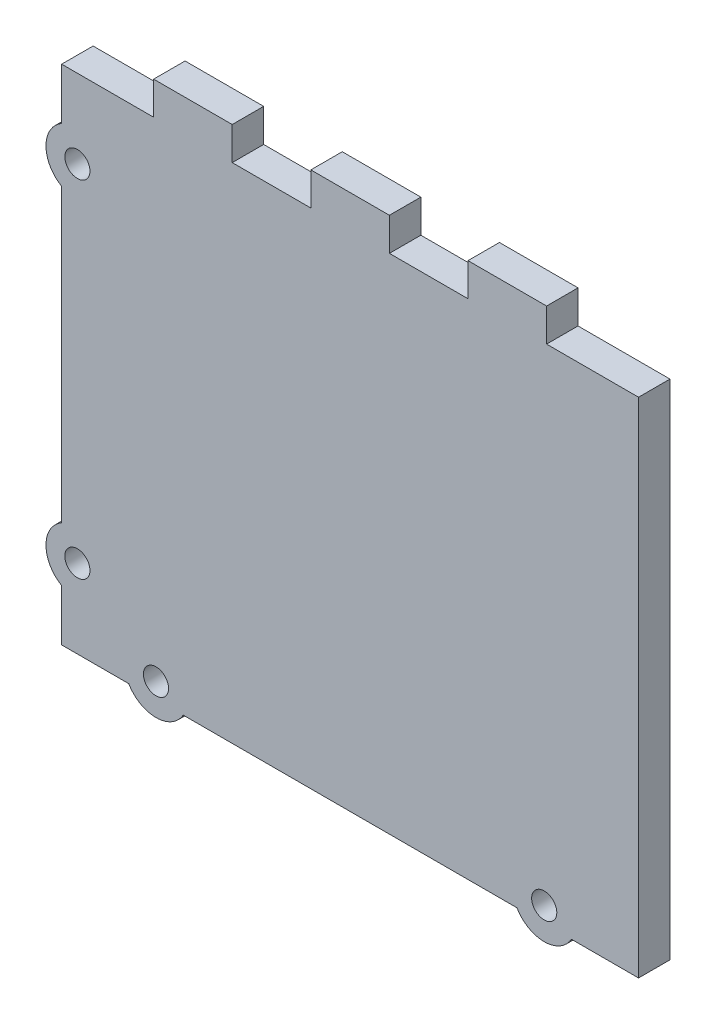
ISO-10303-21;
HEADER;
FILE_DESCRIPTION(('STEP AP214'),'2;1');
FILE_NAME('part.step','',(''),(''),'','','');
FILE_SCHEMA(('AUTOMOTIVE_DESIGN { 1 0 10303 214 1 1 1 1 }'));
ENDSEC;
DATA;
#1=APPLICATION_CONTEXT('core data for automotive mechanical design processes');
#2=APPLICATION_PROTOCOL_DEFINITION('international standard','automotive_design',2000,#1);
#3=PRODUCT_CONTEXT('',#1,'mechanical');
#4=PRODUCT('Part','Part','',(#3));
#5=PRODUCT_RELATED_PRODUCT_CATEGORY('part','',(#4));
#6=PRODUCT_DEFINITION_FORMATION('','',#4);
#7=PRODUCT_DEFINITION_CONTEXT('part definition',#1,'design');
#8=PRODUCT_DEFINITION('design','',#6,#7);
#9=PRODUCT_DEFINITION_SHAPE('','',#8);
#10=(LENGTH_UNIT() NAMED_UNIT(*) SI_UNIT(.MILLI.,.METRE.));
#11=(NAMED_UNIT(*) PLANE_ANGLE_UNIT() SI_UNIT($,.RADIAN.));
#12=(NAMED_UNIT(*) SI_UNIT($,.STERADIAN.) SOLID_ANGLE_UNIT());
#13=UNCERTAINTY_MEASURE_WITH_UNIT(LENGTH_MEASURE(1.E-05),#10,'distance_accuracy_value','');
#14=(GEOMETRIC_REPRESENTATION_CONTEXT(3) GLOBAL_UNCERTAINTY_ASSIGNED_CONTEXT((#13)) GLOBAL_UNIT_ASSIGNED_CONTEXT((#10,
#11,#12)) REPRESENTATION_CONTEXT('',''));
#15=CARTESIAN_POINT('',(0.,0.,0.));
#16=DIRECTION('',(0.,0.,1.));
#17=DIRECTION('',(1.,0.,0.));
#18=AXIS2_PLACEMENT_3D('',#15,#16,#17);
#19=CARTESIAN_POINT('',(25.2000000041631,29.5000000000222,4.));
#20=DIRECTION('',(1.,0.,0.));
#21=DIRECTION('',(0.,0.,-1.));
#22=AXIS2_PLACEMENT_3D('',#19,#20,#21);
#23=PLANE('',#22);
#24=DIRECTION('',(0.,-1.,0.));
#25=VECTOR('',#24,1.);
#26=CARTESIAN_POINT('',(25.2000000041631,29.5000000000222,4.));
#27=LINE('',#26,#25);
#28=CARTESIAN_POINT('',(25.2000000041631,34.0000000000222,4.));
#29=VERTEX_POINT('',#28);
#30=CARTESIAN_POINT('',(25.2000000041631,29.8000000000222,4.));
#31=VERTEX_POINT('',#30);
#32=EDGE_CURVE('E392',#29,#31,#27,.T.);
#33=ORIENTED_EDGE('',*,*,#32,.T.);
#34=DIRECTION('',(0.,0.,-1.));
#35=VECTOR('',#34,1.);
#36=CARTESIAN_POINT('',(25.2000000041631,29.8000000000222,4.));
#37=LINE('',#36,#35);
#38=CARTESIAN_POINT('',(25.2000000041631,29.8000000000222,0.));
#39=VERTEX_POINT('',#38);
#40=EDGE_CURVE('E388',#31,#39,#37,.T.);
#41=ORIENTED_EDGE('',*,*,#40,.T.);
#42=DIRECTION('',(0.,-1.,0.));
#43=VECTOR('',#42,1.);
#44=CARTESIAN_POINT('',(25.2000000041631,29.5000000000222,0.));
#45=LINE('',#44,#43);
#46=CARTESIAN_POINT('',(25.2000000041631,34.0000000000222,0.));
#47=VERTEX_POINT('',#46);
#48=EDGE_CURVE('E391',#47,#39,#45,.T.);
#49=ORIENTED_EDGE('',*,*,#48,.F.);
#50=DIRECTION('',(0.,0.,-1.));
#51=VECTOR('',#50,1.);
#52=CARTESIAN_POINT('',(25.2000000041631,34.0000000000222,4.));
#53=LINE('',#52,#51);
#54=EDGE_CURVE('E51',#29,#47,#53,.T.);
#55=ORIENTED_EDGE('',*,*,#54,.F.);
#56=EDGE_LOOP('',(#33,#41,#49,#55));
#57=FACE_BOUND('',#56,.T.);
#58=ADVANCED_FACE('F43',(#57),#23,.T.);
#59=CARTESIAN_POINT('',(15.2000000041631,29.5000000000222,4.));
#60=DIRECTION('',(-1.,0.,0.));
#61=DIRECTION('',(0.,0.,1.));
#62=AXIS2_PLACEMENT_3D('',#59,#60,#61);
#63=PLANE('',#62);
#64=DIRECTION('',(0.,1.,0.));
#65=VECTOR('',#64,1.);
#66=CARTESIAN_POINT('',(15.2000000041631,29.5000000000222,0.));
#67=LINE('',#66,#65);
#68=CARTESIAN_POINT('',(15.2000000041631,29.8000000000222,0.));
#69=VERTEX_POINT('',#68);
#70=CARTESIAN_POINT('',(15.2000000041631,34.0000000000222,0.));
#71=VERTEX_POINT('',#70);
#72=EDGE_CURVE('E70',#69,#71,#67,.T.);
#73=ORIENTED_EDGE('',*,*,#72,.F.);
#74=DIRECTION('',(0.,0.,1.));
#75=VECTOR('',#74,1.);
#76=CARTESIAN_POINT('',(15.2000000041631,29.8000000000222,4.));
#77=LINE('',#76,#75);
#78=CARTESIAN_POINT('',(15.2000000041631,29.8000000000222,4.));
#79=VERTEX_POINT('',#78);
#80=EDGE_CURVE('E11',#69,#79,#77,.T.);
#81=ORIENTED_EDGE('',*,*,#80,.T.);
#82=DIRECTION('',(0.,1.,0.));
#83=VECTOR('',#82,1.);
#84=CARTESIAN_POINT('',(15.2000000041631,29.5000000000222,4.));
#85=LINE('',#84,#83);
#86=CARTESIAN_POINT('',(15.2000000041631,34.0000000000222,4.));
#87=VERTEX_POINT('',#86);
#88=EDGE_CURVE('E394',#79,#87,#85,.T.);
#89=ORIENTED_EDGE('',*,*,#88,.T.);
#90=DIRECTION('',(0.,0.,-1.));
#91=VECTOR('',#90,1.);
#92=CARTESIAN_POINT('',(15.2000000041631,34.0000000000222,4.));
#93=LINE('',#92,#91);
#94=EDGE_CURVE('E400',#87,#71,#93,.T.);
#95=ORIENTED_EDGE('',*,*,#94,.T.);
#96=EDGE_LOOP('',(#73,#81,#89,#95));
#97=FACE_BOUND('',#96,.T.);
#98=ADVANCED_FACE('F408',(#97),#63,.T.);
#99=CARTESIAN_POINT('',(25.2000000041631,34.0000000000222,4.));
#100=DIRECTION('',(0.,1.,0.));
#101=DIRECTION('',(0.,0.,1.));
#102=AXIS2_PLACEMENT_3D('',#99,#100,#101);
#103=PLANE('',#102);
#104=DIRECTION('',(1.,0.,0.));
#105=VECTOR('',#104,1.);
#106=CARTESIAN_POINT('',(25.2000000041631,34.0000000000222,0.));
#107=LINE('',#106,#105);
#108=EDGE_CURVE('E395',#71,#47,#107,.T.);
#109=ORIENTED_EDGE('',*,*,#108,.F.);
#110=ORIENTED_EDGE('',*,*,#94,.F.);
#111=DIRECTION('',(1.,0.,0.));
#112=VECTOR('',#111,1.);
#113=CARTESIAN_POINT('',(25.2000000041631,34.0000000000222,4.));
#114=LINE('',#113,#112);
#115=EDGE_CURVE('E397',#87,#29,#114,.T.);
#116=ORIENTED_EDGE('',*,*,#115,.T.);
#117=ORIENTED_EDGE('',*,*,#54,.T.);
#118=EDGE_LOOP('',(#109,#110,#116,#117));
#119=FACE_BOUND('',#118,.T.);
#120=ADVANCED_FACE('F411',(#119),#103,.T.);
#121=CARTESIAN_POINT('',(0.,0.,4.));
#122=DIRECTION('',(0.,0.,1.));
#123=DIRECTION('',(1.,0.,0.));
#124=AXIS2_PLACEMENT_3D('',#121,#122,#123);
#125=PLANE('',#124);
#126=ORIENTED_EDGE('',*,*,#88,.F.);
#127=DIRECTION('',(-1.,0.,0.));
#128=VECTOR('',#127,1.);
#129=CARTESIAN_POINT('',(-36.4999999999631,29.8000000000222,4.));
#130=LINE('',#129,#128);
#131=CARTESIAN_POINT('',(5.20000000416307,29.8000000000222,4.));
#132=VERTEX_POINT('',#131);
#133=EDGE_CURVE('E78',#79,#132,#130,.T.);
#134=ORIENTED_EDGE('',*,*,#133,.T.);
#135=DIRECTION('',(0.,-1.,0.));
#136=VECTOR('',#135,1.);
#137=CARTESIAN_POINT('',(5.20000000416307,29.5000000000222,4.));
#138=LINE('',#137,#136);
#139=CARTESIAN_POINT('',(5.20000000416307,34.0000000000222,4.));
#140=VERTEX_POINT('',#139);
#141=EDGE_CURVE('E254',#140,#132,#138,.T.);
#142=ORIENTED_EDGE('',*,*,#141,.F.);
#143=DIRECTION('',(1.,0.,0.));
#144=VECTOR('',#143,1.);
#145=CARTESIAN_POINT('',(5.20000000416307,34.0000000000222,4.));
#146=LINE('',#145,#144);
#147=CARTESIAN_POINT('',(-4.79999999583693,34.0000000000222,4.));
#148=VERTEX_POINT('',#147);
#149=EDGE_CURVE('E250',#148,#140,#146,.T.);
#150=ORIENTED_EDGE('',*,*,#149,.F.);
#151=DIRECTION('',(0.,1.,0.));
#152=VECTOR('',#151,1.);
#153=CARTESIAN_POINT('',(-4.79999999583693,29.5000000000222,4.));
#154=LINE('',#153,#152);
#155=CARTESIAN_POINT('',(-4.79999999583693,29.8000000000222,4.));
#156=VERTEX_POINT('',#155);
#157=EDGE_CURVE('E248',#156,#148,#154,.T.);
#158=ORIENTED_EDGE('',*,*,#157,.F.);
#159=CARTESIAN_POINT('',(-14.7999999958369,29.8000000000222,4.));
#160=VERTEX_POINT('',#159);
#161=EDGE_CURVE('E347',#156,#160,#130,.T.);
#162=ORIENTED_EDGE('',*,*,#161,.T.);
#163=DIRECTION('',(0.,-1.,0.));
#164=VECTOR('',#163,1.);
#165=CARTESIAN_POINT('',(-14.7999999958369,29.5000000000222,4.));
#166=LINE('',#165,#164);
#167=CARTESIAN_POINT('',(-14.7999999958369,34.0000000000222,4.));
#168=VERTEX_POINT('',#167);
#169=EDGE_CURVE('E228',#168,#160,#166,.T.);
#170=ORIENTED_EDGE('',*,*,#169,.F.);
#171=DIRECTION('',(1.,0.,0.));
#172=VECTOR('',#171,1.);
#173=CARTESIAN_POINT('',(-14.7999999958369,34.0000000000222,4.));
#174=LINE('',#173,#172);
#175=CARTESIAN_POINT('',(-24.7999999958369,34.0000000000222,4.));
#176=VERTEX_POINT('',#175);
#177=EDGE_CURVE('E218',#176,#168,#174,.T.);
#178=ORIENTED_EDGE('',*,*,#177,.F.);
#179=DIRECTION('',(0.,1.,0.));
#180=VECTOR('',#179,1.);
#181=CARTESIAN_POINT('',(-24.7999999958369,29.5000000000222,4.));
#182=LINE('',#181,#180);
#183=CARTESIAN_POINT('',(-24.7999999958369,29.8000000000222,4.));
#184=VERTEX_POINT('',#183);
#185=EDGE_CURVE('E208',#184,#176,#182,.T.);
#186=ORIENTED_EDGE('',*,*,#185,.F.);
#187=CARTESIAN_POINT('',(-36.4999999999631,29.8000000000222,4.));
#188=VERTEX_POINT('',#187);
#189=EDGE_CURVE('E341',#184,#188,#130,.T.);
#190=ORIENTED_EDGE('',*,*,#189,.T.);
#191=DIRECTION('',(0.,-1.,0.));
#192=VECTOR('',#191,1.);
#193=CARTESIAN_POINT('',(-36.4999999999631,29.8000000000222,4.));
#194=LINE('',#193,#192);
#195=CARTESIAN_POINT('',(-36.4999999999631,23.2641016151781,4.));
#196=VERTEX_POINT('',#195);
#197=EDGE_CURVE('E348',#188,#196,#194,.T.);
#198=ORIENTED_EDGE('',*,*,#197,.T.);
#199=CARTESIAN_POINT('',(-34.4999999999631,19.8000000000403,4.));
#200=DIRECTION('',(0.,0.,1.));
#201=DIRECTION('',(1.,0.,0.));
#202=AXIS2_PLACEMENT_3D('',#199,#200,#201);
#203=CIRCLE('',#202,4.);
#204=CARTESIAN_POINT('',(-36.4999999999631,16.3358983849026,4.));
#205=VERTEX_POINT('',#204);
#206=EDGE_CURVE('E289',#205,#196,#203,.F.);
#207=ORIENTED_EDGE('',*,*,#206,.F.);
#208=CARTESIAN_POINT('',(-36.4999999999631,-20.7358983848461,4.));
#209=VERTEX_POINT('',#208);
#210=EDGE_CURVE('E352',#205,#209,#194,.T.);
#211=ORIENTED_EDGE('',*,*,#210,.T.);
#212=CARTESIAN_POINT('',(-34.4999999999631,-24.1999999999839,4.));
#213=DIRECTION('',(0.,0.,-1.));
#214=DIRECTION('',(1.,0.,0.));
#215=AXIS2_PLACEMENT_3D('',#212,#213,#214);
#216=CIRCLE('',#215,4.);
#217=CARTESIAN_POINT('',(-36.4999999999631,-27.6641016151217,4.));
#218=VERTEX_POINT('',#217);
#219=EDGE_CURVE('E272',#209,#218,#216,.F.);
#220=ORIENTED_EDGE('',*,*,#219,.T.);
#221=CARTESIAN_POINT('',(-36.4999999999631,-34.1999999999658,4.));
#222=VERTEX_POINT('',#221);
#223=EDGE_CURVE('E346',#218,#222,#194,.T.);
#224=ORIENTED_EDGE('',*,*,#223,.T.);
#225=DIRECTION('',(1.,0.,0.));
#226=VECTOR('',#225,1.);
#227=CARTESIAN_POINT('',(-36.4999999999631,-34.1999999999658,4.));
#228=LINE('',#227,#226);
#229=CARTESIAN_POINT('',(-27.9665338925389,-34.1999999999658,4.));
#230=VERTEX_POINT('',#229);
#231=EDGE_CURVE('E353',#222,#230,#228,.T.);
#232=ORIENTED_EDGE('',*,*,#231,.T.);
#233=CARTESIAN_POINT('',(-24.4999999958439,-32.2042187636916,4.));
#234=DIRECTION('',(0.,0.,-1.));
#235=DIRECTION('',(-1.,0.,0.));
#236=AXIS2_PLACEMENT_3D('',#233,#234,#235);
#237=CIRCLE('',#236,4.);
#238=CARTESIAN_POINT('',(-21.0334660991488,-34.1999999999658,4.));
#239=VERTEX_POINT('',#238);
#240=EDGE_CURVE('E306',#230,#239,#237,.F.);
#241=ORIENTED_EDGE('',*,*,#240,.T.);
#242=CARTESIAN_POINT('',(21.4334661033488,-34.1999999999658,4.));
#243=VERTEX_POINT('',#242);
#244=EDGE_CURVE('E357',#239,#243,#228,.T.);
#245=ORIENTED_EDGE('',*,*,#244,.T.);
#246=CARTESIAN_POINT('',(24.9000000000439,-32.2042187636916,4.));
#247=DIRECTION('',(0.,0.,1.));
#248=DIRECTION('',(1.,0.,0.));
#249=AXIS2_PLACEMENT_3D('',#246,#247,#248);
#250=CIRCLE('',#249,4.);
#251=CARTESIAN_POINT('',(28.366533896739,-34.1999999999658,4.));
#252=VERTEX_POINT('',#251);
#253=EDGE_CURVE('E323',#252,#243,#250,.F.);
#254=ORIENTED_EDGE('',*,*,#253,.F.);
#255=CARTESIAN_POINT('',(36.9000000041631,-34.1999999999658,4.));
#256=VERTEX_POINT('',#255);
#257=EDGE_CURVE('E351',#252,#256,#228,.T.);
#258=ORIENTED_EDGE('',*,*,#257,.T.);
#259=DIRECTION('',(0.,1.,0.));
#260=VECTOR('',#259,1.);
#261=CARTESIAN_POINT('',(36.9000000041631,29.8000000000222,4.));
#262=LINE('',#261,#260);
#263=CARTESIAN_POINT('',(36.9000000041631,29.8000000000222,4.));
#264=VERTEX_POINT('',#263);
#265=EDGE_CURVE('E338',#256,#264,#262,.T.);
#266=ORIENTED_EDGE('',*,*,#265,.T.);
#267=EDGE_CURVE('E343',#264,#31,#130,.T.);
#268=ORIENTED_EDGE('',*,*,#267,.T.);
#269=ORIENTED_EDGE('',*,*,#32,.F.);
#270=ORIENTED_EDGE('',*,*,#115,.F.);
#271=EDGE_LOOP('',(#126,#134,#142,#150,#158,#162,#170,#178,#186,#190,#198,#207,#211,#220,#224,
#232,#241,#245,#254,#258,#266,#268,#269,#270));
#272=FACE_BOUND('',#271,.T.);
#273=CARTESIAN_POINT('',(-34.4999999999631,-24.1999999999839,4.));
#274=DIRECTION('',(0.,0.,-1.));
#275=DIRECTION('',(1.,0.,0.));
#276=AXIS2_PLACEMENT_3D('',#273,#274,#275);
#277=CIRCLE('',#276,1.6);
#278=CARTESIAN_POINT('',(-32.8999999999631,-24.1999999999839,4.));
#279=VERTEX_POINT('',#278);
#280=EDGE_CURVE('E266',#279,#279,#277,.T.);
#281=ORIENTED_EDGE('',*,*,#280,.T.);
#282=EDGE_LOOP('',(#281));
#283=FACE_BOUND('',#282,.T.);
#284=CARTESIAN_POINT('',(-34.4999999999631,19.8000000000403,4.));
#285=DIRECTION('',(0.,0.,1.));
#286=DIRECTION('',(1.,0.,0.));
#287=AXIS2_PLACEMENT_3D('',#284,#285,#286);
#288=CIRCLE('',#287,1.6);
#289=CARTESIAN_POINT('',(-32.8999999999631,19.8000000000403,4.));
#290=VERTEX_POINT('',#289);
#291=EDGE_CURVE('E283',#290,#290,#288,.T.);
#292=ORIENTED_EDGE('',*,*,#291,.F.);
#293=EDGE_LOOP('',(#292));
#294=FACE_BOUND('',#293,.T.);
#295=CARTESIAN_POINT('',(-24.4999999958439,-32.2042187636916,4.));
#296=DIRECTION('',(0.,0.,-1.));
#297=DIRECTION('',(-1.,0.,0.));
#298=AXIS2_PLACEMENT_3D('',#295,#296,#297);
#299=CIRCLE('',#298,1.6);
#300=CARTESIAN_POINT('',(-26.0999999958439,-32.2042187636916,4.));
#301=VERTEX_POINT('',#300);
#302=EDGE_CURVE('E300',#301,#301,#299,.T.);
#303=ORIENTED_EDGE('',*,*,#302,.T.);
#304=EDGE_LOOP('',(#303));
#305=FACE_BOUND('',#304,.T.);
#306=CARTESIAN_POINT('',(24.9000000000439,-32.2042187636916,4.));
#307=DIRECTION('',(0.,0.,1.));
#308=DIRECTION('',(1.,0.,0.));
#309=AXIS2_PLACEMENT_3D('',#306,#307,#308);
#310=CIRCLE('',#309,1.6);
#311=CARTESIAN_POINT('',(26.5000000000439,-32.2042187636916,4.));
#312=VERTEX_POINT('',#311);
#313=EDGE_CURVE('E317',#312,#312,#310,.T.);
#314=ORIENTED_EDGE('',*,*,#313,.F.);
#315=EDGE_LOOP('',(#314));
#316=FACE_BOUND('',#315,.T.);
#317=ADVANCED_FACE('F231',(#272,#283,#294,#305,#316),#125,.T.);
#318=CARTESIAN_POINT('',(0.,0.,0.));
#319=DIRECTION('',(0.,0.,1.));
#320=DIRECTION('',(1.,0.,0.));
#321=AXIS2_PLACEMENT_3D('',#318,#319,#320);
#322=PLANE('',#321);
#323=DIRECTION('',(-1.,0.,0.));
#324=VECTOR('',#323,1.);
#325=CARTESIAN_POINT('',(-36.4999999999631,29.8000000000222,0.));
#326=LINE('',#325,#324);
#327=CARTESIAN_POINT('',(5.20000000416307,29.8000000000222,0.));
#328=VERTEX_POINT('',#327);
#329=EDGE_CURVE('E364',#69,#328,#326,.T.);
#330=ORIENTED_EDGE('',*,*,#329,.F.);
#331=ORIENTED_EDGE('',*,*,#72,.T.);
#332=ORIENTED_EDGE('',*,*,#108,.T.);
#333=ORIENTED_EDGE('',*,*,#48,.T.);
#334=CARTESIAN_POINT('',(36.9000000041631,29.8000000000222,0.));
#335=VERTEX_POINT('',#334);
#336=EDGE_CURVE('E361',#335,#39,#326,.T.);
#337=ORIENTED_EDGE('',*,*,#336,.F.);
#338=DIRECTION('',(0.,1.,0.));
#339=VECTOR('',#338,1.);
#340=CARTESIAN_POINT('',(36.9000000041631,29.8000000000222,0.));
#341=LINE('',#340,#339);
#342=CARTESIAN_POINT('',(36.9000000041631,-34.1999999999658,0.));
#343=VERTEX_POINT('',#342);
#344=EDGE_CURVE('E335',#343,#335,#341,.T.);
#345=ORIENTED_EDGE('',*,*,#344,.F.);
#346=DIRECTION('',(1.,0.,0.));
#347=VECTOR('',#346,1.);
#348=CARTESIAN_POINT('',(-36.4999999999631,-34.1999999999658,0.));
#349=LINE('',#348,#347);
#350=CARTESIAN_POINT('',(28.366533896739,-34.1999999999658,0.));
#351=VERTEX_POINT('',#350);
#352=EDGE_CURVE('E368',#351,#343,#349,.T.);
#353=ORIENTED_EDGE('',*,*,#352,.F.);
#354=CARTESIAN_POINT('',(24.9000000000439,-32.2042187636916,0.));
#355=DIRECTION('',(0.,0.,1.));
#356=DIRECTION('',(1.,0.,0.));
#357=AXIS2_PLACEMENT_3D('',#354,#355,#356);
#358=CIRCLE('',#357,4.);
#359=CARTESIAN_POINT('',(21.4334661033488,-34.1999999999658,0.));
#360=VERTEX_POINT('',#359);
#361=EDGE_CURVE('E326',#351,#360,#358,.F.);
#362=ORIENTED_EDGE('',*,*,#361,.T.);
#363=CARTESIAN_POINT('',(-21.0334660991488,-34.1999999999658,0.));
#364=VERTEX_POINT('',#363);
#365=EDGE_CURVE('E371',#364,#360,#349,.T.);
#366=ORIENTED_EDGE('',*,*,#365,.F.);
#367=CARTESIAN_POINT('',(-24.4999999958439,-32.2042187636916,0.));
#368=DIRECTION('',(0.,0.,-1.));
#369=DIRECTION('',(-1.,0.,0.));
#370=AXIS2_PLACEMENT_3D('',#367,#368,#369);
#371=CIRCLE('',#370,4.);
#372=CARTESIAN_POINT('',(-27.9665338925389,-34.1999999999658,0.));
#373=VERTEX_POINT('',#372);
#374=EDGE_CURVE('E309',#373,#364,#371,.F.);
#375=ORIENTED_EDGE('',*,*,#374,.F.);
#376=CARTESIAN_POINT('',(-36.4999999999631,-34.1999999999658,0.));
#377=VERTEX_POINT('',#376);
#378=EDGE_CURVE('E342',#377,#373,#349,.T.);
#379=ORIENTED_EDGE('',*,*,#378,.F.);
#380=DIRECTION('',(0.,-1.,0.));
#381=VECTOR('',#380,1.);
#382=CARTESIAN_POINT('',(-36.4999999999631,29.8000000000222,0.));
#383=LINE('',#382,#381);
#384=CARTESIAN_POINT('',(-36.4999999999631,-27.6641016151217,0.));
#385=VERTEX_POINT('',#384);
#386=EDGE_CURVE('E363',#385,#377,#383,.T.);
#387=ORIENTED_EDGE('',*,*,#386,.F.);
#388=CARTESIAN_POINT('',(-34.4999999999631,-24.1999999999839,0.));
#389=DIRECTION('',(0.,0.,-1.));
#390=DIRECTION('',(1.,0.,0.));
#391=AXIS2_PLACEMENT_3D('',#388,#389,#390);
#392=CIRCLE('',#391,4.);
#393=CARTESIAN_POINT('',(-36.4999999999631,-20.7358983848461,0.));
#394=VERTEX_POINT('',#393);
#395=EDGE_CURVE('E275',#394,#385,#392,.F.);
#396=ORIENTED_EDGE('',*,*,#395,.F.);
#397=CARTESIAN_POINT('',(-36.4999999999631,16.3358983849026,0.));
#398=VERTEX_POINT('',#397);
#399=EDGE_CURVE('E369',#398,#394,#383,.T.);
#400=ORIENTED_EDGE('',*,*,#399,.F.);
#401=CARTESIAN_POINT('',(-34.4999999999631,19.8000000000403,0.));
#402=DIRECTION('',(0.,0.,1.));
#403=DIRECTION('',(1.,0.,0.));
#404=AXIS2_PLACEMENT_3D('',#401,#402,#403);
#405=CIRCLE('',#404,4.);
#406=CARTESIAN_POINT('',(-36.4999999999631,23.2641016151781,0.));
#407=VERTEX_POINT('',#406);
#408=EDGE_CURVE('E292',#398,#407,#405,.F.);
#409=ORIENTED_EDGE('',*,*,#408,.T.);
#410=CARTESIAN_POINT('',(-36.4999999999631,29.8000000000222,0.));
#411=VERTEX_POINT('',#410);
#412=EDGE_CURVE('E366',#411,#407,#383,.T.);
#413=ORIENTED_EDGE('',*,*,#412,.F.);
#414=CARTESIAN_POINT('',(-24.7999999958369,29.8000000000222,0.));
#415=VERTEX_POINT('',#414);
#416=EDGE_CURVE('E360',#415,#411,#326,.T.);
#417=ORIENTED_EDGE('',*,*,#416,.F.);
#418=DIRECTION('',(0.,1.,0.));
#419=VECTOR('',#418,1.);
#420=CARTESIAN_POINT('',(-24.7999999958369,29.5000000000222,0.));
#421=LINE('',#420,#419);
#422=CARTESIAN_POINT('',(-24.7999999958369,34.0000000000222,0.));
#423=VERTEX_POINT('',#422);
#424=EDGE_CURVE('E237',#415,#423,#421,.T.);
#425=ORIENTED_EDGE('',*,*,#424,.T.);
#426=DIRECTION('',(1.,0.,0.));
#427=VECTOR('',#426,1.);
#428=CARTESIAN_POINT('',(-14.7999999958369,34.0000000000222,0.));
#429=LINE('',#428,#427);
#430=CARTESIAN_POINT('',(-14.7999999958369,34.0000000000222,0.));
#431=VERTEX_POINT('',#430);
#432=EDGE_CURVE('E226',#423,#431,#429,.T.);
#433=ORIENTED_EDGE('',*,*,#432,.T.);
#434=DIRECTION('',(0.,-1.,0.));
#435=VECTOR('',#434,1.);
#436=CARTESIAN_POINT('',(-14.7999999958369,29.5000000000222,0.));
#437=LINE('',#436,#435);
#438=CARTESIAN_POINT('',(-14.7999999958369,29.8000000000222,0.));
#439=VERTEX_POINT('',#438);
#440=EDGE_CURVE('E219',#431,#439,#437,.T.);
#441=ORIENTED_EDGE('',*,*,#440,.T.);
#442=CARTESIAN_POINT('',(-4.79999999583693,29.8000000000222,0.));
#443=VERTEX_POINT('',#442);
#444=EDGE_CURVE('E365',#443,#439,#326,.T.);
#445=ORIENTED_EDGE('',*,*,#444,.F.);
#446=DIRECTION('',(0.,1.,0.));
#447=VECTOR('',#446,1.);
#448=CARTESIAN_POINT('',(-4.79999999583693,29.5000000000222,0.));
#449=LINE('',#448,#447);
#450=CARTESIAN_POINT('',(-4.79999999583693,34.0000000000222,0.));
#451=VERTEX_POINT('',#450);
#452=EDGE_CURVE('E247',#443,#451,#449,.T.);
#453=ORIENTED_EDGE('',*,*,#452,.T.);
#454=DIRECTION('',(1.,0.,0.));
#455=VECTOR('',#454,1.);
#456=CARTESIAN_POINT('',(5.20000000416307,34.0000000000222,0.));
#457=LINE('',#456,#455);
#458=CARTESIAN_POINT('',(5.20000000416307,34.0000000000222,0.));
#459=VERTEX_POINT('',#458);
#460=EDGE_CURVE('E259',#451,#459,#457,.T.);
#461=ORIENTED_EDGE('',*,*,#460,.T.);
#462=DIRECTION('',(0.,-1.,0.));
#463=VECTOR('',#462,1.);
#464=CARTESIAN_POINT('',(5.20000000416307,29.5000000000222,0.));
#465=LINE('',#464,#463);
#466=EDGE_CURVE('E251',#459,#328,#465,.T.);
#467=ORIENTED_EDGE('',*,*,#466,.T.);
#468=EDGE_LOOP('',(#330,#331,#332,#333,#337,#345,#353,#362,#366,#375,#379,#387,#396,#400,#409,
#413,#417,#425,#433,#441,#445,#453,#461,#467));
#469=FACE_BOUND('',#468,.T.);
#470=CARTESIAN_POINT('',(-34.4999999999631,-24.1999999999839,0.));
#471=DIRECTION('',(0.,0.,-1.));
#472=DIRECTION('',(1.,0.,0.));
#473=AXIS2_PLACEMENT_3D('',#470,#471,#472);
#474=CIRCLE('',#473,1.6);
#475=CARTESIAN_POINT('',(-32.8999999999631,-24.1999999999839,0.));
#476=VERTEX_POINT('',#475);
#477=EDGE_CURVE('E269',#476,#476,#474,.T.);
#478=ORIENTED_EDGE('',*,*,#477,.F.);
#479=EDGE_LOOP('',(#478));
#480=FACE_BOUND('',#479,.T.);
#481=CARTESIAN_POINT('',(-34.4999999999631,19.8000000000403,0.));
#482=DIRECTION('',(0.,0.,1.));
#483=DIRECTION('',(1.,0.,0.));
#484=AXIS2_PLACEMENT_3D('',#481,#482,#483);
#485=CIRCLE('',#484,1.6);
#486=CARTESIAN_POINT('',(-32.8999999999631,19.8000000000403,0.));
#487=VERTEX_POINT('',#486);
#488=EDGE_CURVE('E286',#487,#487,#485,.T.);
#489=ORIENTED_EDGE('',*,*,#488,.T.);
#490=EDGE_LOOP('',(#489));
#491=FACE_BOUND('',#490,.T.);
#492=CARTESIAN_POINT('',(-24.4999999958439,-32.2042187636916,0.));
#493=DIRECTION('',(0.,0.,-1.));
#494=DIRECTION('',(-1.,0.,0.));
#495=AXIS2_PLACEMENT_3D('',#492,#493,#494);
#496=CIRCLE('',#495,1.6);
#497=CARTESIAN_POINT('',(-26.0999999958439,-32.2042187636916,0.));
#498=VERTEX_POINT('',#497);
#499=EDGE_CURVE('E303',#498,#498,#496,.T.);
#500=ORIENTED_EDGE('',*,*,#499,.F.);
#501=EDGE_LOOP('',(#500));
#502=FACE_BOUND('',#501,.T.);
#503=CARTESIAN_POINT('',(24.9000000000439,-32.2042187636916,0.));
#504=DIRECTION('',(0.,0.,1.));
#505=DIRECTION('',(1.,0.,0.));
#506=AXIS2_PLACEMENT_3D('',#503,#504,#505);
#507=CIRCLE('',#506,1.6);
#508=CARTESIAN_POINT('',(26.5000000000439,-32.2042187636916,0.));
#509=VERTEX_POINT('',#508);
#510=EDGE_CURVE('E320',#509,#509,#507,.T.);
#511=ORIENTED_EDGE('',*,*,#510,.T.);
#512=EDGE_LOOP('',(#511));
#513=FACE_BOUND('',#512,.T.);
#514=ADVANCED_FACE('F412',(#469,#480,#491,#502,#513),#322,.F.);
#515=CARTESIAN_POINT('',(-36.4999999999631,29.8000000000222,4.));
#516=DIRECTION('',(0.,-1.,0.));
#517=DIRECTION('',(0.,0.,-1.));
#518=AXIS2_PLACEMENT_3D('',#515,#516,#517);
#519=PLANE('',#518);
#520=ORIENTED_EDGE('',*,*,#40,.F.);
#521=ORIENTED_EDGE('',*,*,#267,.F.);
#522=DIRECTION('',(0.,0.,-1.));
#523=VECTOR('',#522,1.);
#524=CARTESIAN_POINT('',(36.9000000041631,29.8000000000222,4.));
#525=LINE('',#524,#523);
#526=EDGE_CURVE('E380',#264,#335,#525,.T.);
#527=ORIENTED_EDGE('',*,*,#526,.T.);
#528=ORIENTED_EDGE('',*,*,#336,.T.);
#529=EDGE_LOOP('',(#520,#521,#527,#528));
#530=FACE_BOUND('',#529,.T.);
#531=ADVANCED_FACE('F416',(#530),#519,.F.);
#532=ORIENTED_EDGE('',*,*,#444,.T.);
#533=DIRECTION('',(0.,0.,1.));
#534=VECTOR('',#533,1.);
#535=CARTESIAN_POINT('',(-14.7999999958369,29.8000000000222,4.));
#536=LINE('',#535,#534);
#537=EDGE_CURVE('E244',#439,#160,#536,.T.);
#538=ORIENTED_EDGE('',*,*,#537,.T.);
#539=ORIENTED_EDGE('',*,*,#161,.F.);
#540=DIRECTION('',(0.,0.,-1.));
#541=VECTOR('',#540,1.);
#542=CARTESIAN_POINT('',(-4.79999999583693,29.8000000000222,4.));
#543=LINE('',#542,#541);
#544=EDGE_CURVE('E383',#156,#443,#543,.T.);
#545=ORIENTED_EDGE('',*,*,#544,.T.);
#546=EDGE_LOOP('',(#532,#538,#539,#545));
#547=FACE_BOUND('',#546,.T.);
#548=ADVANCED_FACE('F531',(#547),#519,.F.);
#549=ORIENTED_EDGE('',*,*,#80,.F.);
#550=ORIENTED_EDGE('',*,*,#329,.T.);
#551=DIRECTION('',(0.,0.,1.));
#552=VECTOR('',#551,1.);
#553=CARTESIAN_POINT('',(5.20000000416307,29.8000000000222,4.));
#554=LINE('',#553,#552);
#555=EDGE_CURVE('E386',#328,#132,#554,.T.);
#556=ORIENTED_EDGE('',*,*,#555,.T.);
#557=ORIENTED_EDGE('',*,*,#133,.F.);
#558=EDGE_LOOP('',(#549,#550,#556,#557));
#559=FACE_BOUND('',#558,.T.);
#560=ADVANCED_FACE('F489',(#559),#519,.F.);
#561=CARTESIAN_POINT('',(-36.4999999999631,29.8000000000222,4.));
#562=DIRECTION('',(1.,0.,0.));
#563=DIRECTION('',(0.,1.,0.));
#564=AXIS2_PLACEMENT_3D('',#561,#562,#563);
#565=PLANE('',#564);
#566=ORIENTED_EDGE('',*,*,#399,.T.);
#567=DIRECTION('',(0.,0.,1.));
#568=VECTOR('',#567,1.);
#569=CARTESIAN_POINT('',(-36.4999999999631,-20.7358983848461,0.));
#570=LINE('',#569,#568);
#571=EDGE_CURVE('E281',#394,#209,#570,.T.);
#572=ORIENTED_EDGE('',*,*,#571,.T.);
#573=ORIENTED_EDGE('',*,*,#210,.F.);
#574=DIRECTION('',(0.,0.,1.));
#575=VECTOR('',#574,1.);
#576=CARTESIAN_POINT('',(-36.4999999999631,16.3358983849026,0.));
#577=LINE('',#576,#575);
#578=EDGE_CURVE('E295',#398,#205,#577,.T.);
#579=ORIENTED_EDGE('',*,*,#578,.F.);
#580=EDGE_LOOP('',(#566,#572,#573,#579));
#581=FACE_BOUND('',#580,.T.);
#582=ADVANCED_FACE('F452',(#581),#565,.F.);
#583=DIRECTION('',(0.,0.,1.));
#584=VECTOR('',#583,1.);
#585=CARTESIAN_POINT('',(-36.4999999999631,23.2641016151781,0.));
#586=LINE('',#585,#584);
#587=EDGE_CURVE('E298',#407,#196,#586,.T.);
#588=ORIENTED_EDGE('',*,*,#587,.T.);
#589=ORIENTED_EDGE('',*,*,#197,.F.);
#590=DIRECTION('',(0.,0.,-1.));
#591=VECTOR('',#590,1.);
#592=CARTESIAN_POINT('',(-36.4999999999631,29.8000000000222,4.));
#593=LINE('',#592,#591);
#594=EDGE_CURVE('E377',#188,#411,#593,.T.);
#595=ORIENTED_EDGE('',*,*,#594,.T.);
#596=ORIENTED_EDGE('',*,*,#412,.T.);
#597=EDGE_LOOP('',(#588,#589,#595,#596));
#598=FACE_BOUND('',#597,.T.);
#599=ADVANCED_FACE('F490',(#598),#565,.F.);
#600=ORIENTED_EDGE('',*,*,#223,.F.);
#601=DIRECTION('',(0.,0.,1.));
#602=VECTOR('',#601,1.);
#603=CARTESIAN_POINT('',(-36.4999999999631,-27.6641016151217,0.));
#604=LINE('',#603,#602);
#605=EDGE_CURVE('E278',#385,#218,#604,.T.);
#606=ORIENTED_EDGE('',*,*,#605,.F.);
#607=ORIENTED_EDGE('',*,*,#386,.T.);
#608=DIRECTION('',(0.,0.,-1.));
#609=VECTOR('',#608,1.);
#610=CARTESIAN_POINT('',(-36.4999999999631,-34.1999999999658,4.));
#611=LINE('',#610,#609);
#612=EDGE_CURVE('E374',#222,#377,#611,.T.);
#613=ORIENTED_EDGE('',*,*,#612,.F.);
#614=EDGE_LOOP('',(#600,#606,#607,#613));
#615=FACE_BOUND('',#614,.T.);
#616=ADVANCED_FACE('F447',(#615),#565,.F.);
#617=CARTESIAN_POINT('',(-36.4999999999631,-34.1999999999658,4.));
#618=DIRECTION('',(0.,1.,0.));
#619=DIRECTION('',(-1.,0.,0.));
#620=AXIS2_PLACEMENT_3D('',#617,#618,#619);
#621=PLANE('',#620);
#622=ORIENTED_EDGE('',*,*,#378,.T.);
#623=DIRECTION('',(0.,0.,1.));
#624=VECTOR('',#623,1.);
#625=CARTESIAN_POINT('',(-27.9665338925389,-34.1999999999658,0.));
#626=LINE('',#625,#624);
#627=EDGE_CURVE('E315',#373,#230,#626,.T.);
#628=ORIENTED_EDGE('',*,*,#627,.T.);
#629=ORIENTED_EDGE('',*,*,#231,.F.);
#630=ORIENTED_EDGE('',*,*,#612,.T.);
#631=EDGE_LOOP('',(#622,#628,#629,#630));
#632=FACE_BOUND('',#631,.T.);
#633=ADVANCED_FACE('F441',(#632),#621,.F.);
#634=ORIENTED_EDGE('',*,*,#244,.F.);
#635=DIRECTION('',(0.,0.,1.));
#636=VECTOR('',#635,1.);
#637=CARTESIAN_POINT('',(-21.0334660991488,-34.1999999999658,0.));
#638=LINE('',#637,#636);
#639=EDGE_CURVE('E312',#364,#239,#638,.T.);
#640=ORIENTED_EDGE('',*,*,#639,.F.);
#641=ORIENTED_EDGE('',*,*,#365,.T.);
#642=DIRECTION('',(0.,0.,1.));
#643=VECTOR('',#642,1.);
#644=CARTESIAN_POINT('',(21.4334661033488,-34.1999999999658,0.));
#645=LINE('',#644,#643);
#646=EDGE_CURVE('E332',#360,#243,#645,.T.);
#647=ORIENTED_EDGE('',*,*,#646,.T.);
#648=EDGE_LOOP('',(#634,#640,#641,#647));
#649=FACE_BOUND('',#648,.T.);
#650=ADVANCED_FACE('F431',(#649),#621,.F.);
#651=DIRECTION('',(0.,0.,1.));
#652=VECTOR('',#651,1.);
#653=CARTESIAN_POINT('',(28.366533896739,-34.1999999999658,0.));
#654=LINE('',#653,#652);
#655=EDGE_CURVE('E329',#351,#252,#654,.T.);
#656=ORIENTED_EDGE('',*,*,#655,.F.);
#657=ORIENTED_EDGE('',*,*,#352,.T.);
#658=DIRECTION('',(0.,0.,-1.));
#659=VECTOR('',#658,1.);
#660=CARTESIAN_POINT('',(36.9000000041631,-34.1999999999658,4.));
#661=LINE('',#660,#659);
#662=EDGE_CURVE('E356',#256,#343,#661,.T.);
#663=ORIENTED_EDGE('',*,*,#662,.F.);
#664=ORIENTED_EDGE('',*,*,#257,.F.);
#665=EDGE_LOOP('',(#656,#657,#663,#664));
#666=FACE_BOUND('',#665,.T.);
#667=ADVANCED_FACE('F427',(#666),#621,.F.);
#668=CARTESIAN_POINT('',(36.9000000041631,29.8000000000222,4.));
#669=DIRECTION('',(-1.,0.,0.));
#670=DIRECTION('',(0.,-1.,0.));
#671=AXIS2_PLACEMENT_3D('',#668,#669,#670);
#672=PLANE('',#671);
#673=ORIENTED_EDGE('',*,*,#344,.T.);
#674=ORIENTED_EDGE('',*,*,#526,.F.);
#675=ORIENTED_EDGE('',*,*,#265,.F.);
#676=ORIENTED_EDGE('',*,*,#662,.T.);
#677=EDGE_LOOP('',(#673,#674,#675,#676));
#678=FACE_BOUND('',#677,.T.);
#679=ADVANCED_FACE('F422',(#678),#672,.F.);
#680=ORIENTED_EDGE('',*,*,#189,.F.);
#681=DIRECTION('',(0.,0.,-1.));
#682=VECTOR('',#681,1.);
#683=CARTESIAN_POINT('',(-24.7999999958369,29.8000000000222,4.));
#684=LINE('',#683,#682);
#685=EDGE_CURVE('E214',#184,#415,#684,.T.);
#686=ORIENTED_EDGE('',*,*,#685,.T.);
#687=ORIENTED_EDGE('',*,*,#416,.T.);
#688=ORIENTED_EDGE('',*,*,#594,.F.);
#689=EDGE_LOOP('',(#680,#686,#687,#688));
#690=FACE_BOUND('',#689,.T.);
#691=ADVANCED_FACE('F485',(#690),#519,.F.);
#692=CARTESIAN_POINT('',(24.9000000000439,-32.2042187636916,0.));
#693=DIRECTION('',(0.,0.,1.));
#694=DIRECTION('',(1.,0.,0.));
#695=AXIS2_PLACEMENT_3D('',#692,#693,#694);
#696=CYLINDRICAL_SURFACE('',#695,4.);
#697=ORIENTED_EDGE('',*,*,#253,.T.);
#698=ORIENTED_EDGE('',*,*,#646,.F.);
#699=ORIENTED_EDGE('',*,*,#361,.F.);
#700=ORIENTED_EDGE('',*,*,#655,.T.);
#701=EDGE_LOOP('',(#697,#698,#699,#700));
#702=FACE_BOUND('',#701,.T.);
#703=ADVANCED_FACE('F429',(#702),#696,.T.);
#704=CARTESIAN_POINT('',(24.9000000000439,-32.2042187636916,0.));
#705=DIRECTION('',(0.,0.,1.));
#706=DIRECTION('',(1.,0.,0.));
#707=AXIS2_PLACEMENT_3D('',#704,#705,#706);
#708=CYLINDRICAL_SURFACE('',#707,1.6);
#709=ORIENTED_EDGE('',*,*,#510,.F.);
#710=EDGE_LOOP('',(#709));
#711=FACE_BOUND('',#710,.T.);
#712=ORIENTED_EDGE('',*,*,#313,.T.);
#713=EDGE_LOOP('',(#712));
#714=FACE_BOUND('',#713,.T.);
#715=ADVANCED_FACE('F498',(#711,#714),#708,.F.);
#716=CARTESIAN_POINT('',(-24.4999999958439,-32.2042187636916,0.));
#717=DIRECTION('',(0.,0.,1.));
#718=DIRECTION('',(1.,0.,0.));
#719=AXIS2_PLACEMENT_3D('',#716,#717,#718);
#720=CYLINDRICAL_SURFACE('',#719,4.);
#721=ORIENTED_EDGE('',*,*,#240,.F.);
#722=ORIENTED_EDGE('',*,*,#627,.F.);
#723=ORIENTED_EDGE('',*,*,#374,.T.);
#724=ORIENTED_EDGE('',*,*,#639,.T.);
#725=EDGE_LOOP('',(#721,#722,#723,#724));
#726=FACE_BOUND('',#725,.T.);
#727=ADVANCED_FACE('F438',(#726),#720,.T.);
#728=CARTESIAN_POINT('',(-24.4999999958439,-32.2042187636916,0.));
#729=DIRECTION('',(0.,0.,1.));
#730=DIRECTION('',(1.,0.,0.));
#731=AXIS2_PLACEMENT_3D('',#728,#729,#730);
#732=CYLINDRICAL_SURFACE('',#731,1.6);
#733=ORIENTED_EDGE('',*,*,#499,.T.);
#734=EDGE_LOOP('',(#733));
#735=FACE_BOUND('',#734,.T.);
#736=ORIENTED_EDGE('',*,*,#302,.F.);
#737=EDGE_LOOP('',(#736));
#738=FACE_BOUND('',#737,.T.);
#739=ADVANCED_FACE('F504',(#735,#738),#732,.F.);
#740=CARTESIAN_POINT('',(-34.4999999999631,19.8000000000403,0.));
#741=DIRECTION('',(0.,0.,1.));
#742=DIRECTION('',(1.,0.,0.));
#743=AXIS2_PLACEMENT_3D('',#740,#741,#742);
#744=CYLINDRICAL_SURFACE('',#743,4.);
#745=ORIENTED_EDGE('',*,*,#206,.T.);
#746=ORIENTED_EDGE('',*,*,#587,.F.);
#747=ORIENTED_EDGE('',*,*,#408,.F.);
#748=ORIENTED_EDGE('',*,*,#578,.T.);
#749=EDGE_LOOP('',(#745,#746,#747,#748));
#750=FACE_BOUND('',#749,.T.);
#751=ADVANCED_FACE('F466',(#750),#744,.T.);
#752=CARTESIAN_POINT('',(-34.4999999999631,19.8000000000403,0.));
#753=DIRECTION('',(0.,0.,1.));
#754=DIRECTION('',(1.,0.,0.));
#755=AXIS2_PLACEMENT_3D('',#752,#753,#754);
#756=CYLINDRICAL_SURFACE('',#755,1.6);
#757=ORIENTED_EDGE('',*,*,#488,.F.);
#758=EDGE_LOOP('',(#757));
#759=FACE_BOUND('',#758,.T.);
#760=ORIENTED_EDGE('',*,*,#291,.T.);
#761=EDGE_LOOP('',(#760));
#762=FACE_BOUND('',#761,.T.);
#763=ADVANCED_FACE('F458',(#759,#762),#756,.F.);
#764=CARTESIAN_POINT('',(-34.4999999999631,-24.1999999999839,0.));
#765=DIRECTION('',(0.,0.,1.));
#766=DIRECTION('',(1.,0.,0.));
#767=AXIS2_PLACEMENT_3D('',#764,#765,#766);
#768=CYLINDRICAL_SURFACE('',#767,4.);
#769=ORIENTED_EDGE('',*,*,#219,.F.);
#770=ORIENTED_EDGE('',*,*,#571,.F.);
#771=ORIENTED_EDGE('',*,*,#395,.T.);
#772=ORIENTED_EDGE('',*,*,#605,.T.);
#773=EDGE_LOOP('',(#769,#770,#771,#772));
#774=FACE_BOUND('',#773,.T.);
#775=ADVANCED_FACE('F455',(#774),#768,.T.);
#776=CARTESIAN_POINT('',(-34.4999999999631,-24.1999999999839,0.));
#777=DIRECTION('',(0.,0.,1.));
#778=DIRECTION('',(1.,0.,0.));
#779=AXIS2_PLACEMENT_3D('',#776,#777,#778);
#780=CYLINDRICAL_SURFACE('',#779,1.6);
#781=ORIENTED_EDGE('',*,*,#477,.T.);
#782=EDGE_LOOP('',(#781));
#783=FACE_BOUND('',#782,.T.);
#784=ORIENTED_EDGE('',*,*,#280,.F.);
#785=EDGE_LOOP('',(#784));
#786=FACE_BOUND('',#785,.T.);
#787=ADVANCED_FACE('F457',(#783,#786),#780,.F.);
#788=CARTESIAN_POINT('',(5.20000000416307,29.5000000000222,4.));
#789=DIRECTION('',(1.,0.,0.));
#790=DIRECTION('',(0.,0.,-1.));
#791=AXIS2_PLACEMENT_3D('',#788,#789,#790);
#792=PLANE('',#791);
#793=ORIENTED_EDGE('',*,*,#555,.F.);
#794=ORIENTED_EDGE('',*,*,#466,.F.);
#795=DIRECTION('',(0.,0.,-1.));
#796=VECTOR('',#795,1.);
#797=CARTESIAN_POINT('',(5.20000000416307,34.0000000000222,4.));
#798=LINE('',#797,#796);
#799=EDGE_CURVE('E264',#140,#459,#798,.T.);
#800=ORIENTED_EDGE('',*,*,#799,.F.);
#801=ORIENTED_EDGE('',*,*,#141,.T.);
#802=EDGE_LOOP('',(#793,#794,#800,#801));
#803=FACE_BOUND('',#802,.T.);
#804=ADVANCED_FACE('F463',(#803),#792,.T.);
#805=CARTESIAN_POINT('',(-4.79999999583693,29.5000000000222,4.));
#806=DIRECTION('',(-1.,0.,0.));
#807=DIRECTION('',(0.,0.,1.));
#808=AXIS2_PLACEMENT_3D('',#805,#806,#807);
#809=PLANE('',#808);
#810=ORIENTED_EDGE('',*,*,#544,.F.);
#811=ORIENTED_EDGE('',*,*,#157,.T.);
#812=DIRECTION('',(0.,0.,-1.));
#813=VECTOR('',#812,1.);
#814=CARTESIAN_POINT('',(-4.79999999583693,34.0000000000222,4.));
#815=LINE('',#814,#813);
#816=EDGE_CURVE('E257',#148,#451,#815,.T.);
#817=ORIENTED_EDGE('',*,*,#816,.T.);
#818=ORIENTED_EDGE('',*,*,#452,.F.);
#819=EDGE_LOOP('',(#810,#811,#817,#818));
#820=FACE_BOUND('',#819,.T.);
#821=ADVANCED_FACE('F542',(#820),#809,.T.);
#822=CARTESIAN_POINT('',(5.20000000416307,34.0000000000222,4.));
#823=DIRECTION('',(0.,1.,0.));
#824=DIRECTION('',(0.,0.,1.));
#825=AXIS2_PLACEMENT_3D('',#822,#823,#824);
#826=PLANE('',#825);
#827=ORIENTED_EDGE('',*,*,#460,.F.);
#828=ORIENTED_EDGE('',*,*,#816,.F.);
#829=ORIENTED_EDGE('',*,*,#149,.T.);
#830=ORIENTED_EDGE('',*,*,#799,.T.);
#831=EDGE_LOOP('',(#827,#828,#829,#830));
#832=FACE_BOUND('',#831,.T.);
#833=ADVANCED_FACE('F526',(#832),#826,.T.);
#834=CARTESIAN_POINT('',(-14.7999999958369,29.5000000000222,4.));
#835=DIRECTION('',(1.,0.,0.));
#836=DIRECTION('',(0.,0.,-1.));
#837=AXIS2_PLACEMENT_3D('',#834,#835,#836);
#838=PLANE('',#837);
#839=ORIENTED_EDGE('',*,*,#537,.F.);
#840=ORIENTED_EDGE('',*,*,#440,.F.);
#841=DIRECTION('',(0.,0.,-1.));
#842=VECTOR('',#841,1.);
#843=CARTESIAN_POINT('',(-14.7999999958369,34.0000000000222,4.));
#844=LINE('',#843,#842);
#845=EDGE_CURVE('E227',#168,#431,#844,.T.);
#846=ORIENTED_EDGE('',*,*,#845,.F.);
#847=ORIENTED_EDGE('',*,*,#169,.T.);
#848=EDGE_LOOP('',(#839,#840,#846,#847));
#849=FACE_BOUND('',#848,.T.);
#850=ADVANCED_FACE('F534',(#849),#838,.T.);
#851=CARTESIAN_POINT('',(-24.7999999958369,29.5000000000222,4.));
#852=DIRECTION('',(-1.,0.,0.));
#853=DIRECTION('',(0.,0.,1.));
#854=AXIS2_PLACEMENT_3D('',#851,#852,#853);
#855=PLANE('',#854);
#856=ORIENTED_EDGE('',*,*,#685,.F.);
#857=ORIENTED_EDGE('',*,*,#185,.T.);
#858=DIRECTION('',(0.,0.,-1.));
#859=VECTOR('',#858,1.);
#860=CARTESIAN_POINT('',(-24.7999999958369,34.0000000000222,4.));
#861=LINE('',#860,#859);
#862=EDGE_CURVE('E211',#176,#423,#861,.T.);
#863=ORIENTED_EDGE('',*,*,#862,.T.);
#864=ORIENTED_EDGE('',*,*,#424,.F.);
#865=EDGE_LOOP('',(#856,#857,#863,#864));
#866=FACE_BOUND('',#865,.T.);
#867=ADVANCED_FACE('F210',(#866),#855,.T.);
#868=CARTESIAN_POINT('',(-14.7999999958369,34.0000000000222,4.));
#869=DIRECTION('',(0.,1.,0.));
#870=DIRECTION('',(0.,0.,1.));
#871=AXIS2_PLACEMENT_3D('',#868,#869,#870);
#872=PLANE('',#871);
#873=ORIENTED_EDGE('',*,*,#432,.F.);
#874=ORIENTED_EDGE('',*,*,#862,.F.);
#875=ORIENTED_EDGE('',*,*,#177,.T.);
#876=ORIENTED_EDGE('',*,*,#845,.T.);
#877=EDGE_LOOP('',(#873,#874,#875,#876));
#878=FACE_BOUND('',#877,.T.);
#879=ADVANCED_FACE('F223',(#878),#872,.T.);
#880=CLOSED_SHELL('',(#58,#98,#120,#317,#514,#531,#548,#560,#582,#599,#616,#633,#650,#667,#679,
#691,#703,#715,#727,#739,#751,#763,#775,#787,#804,#821,#833,#850,#867,#879));
#881=MANIFOLD_SOLID_BREP('B2',#880);
#882=ADVANCED_BREP_SHAPE_REPRESENTATION('',(#18,#881),#14);
#883=SHAPE_DEFINITION_REPRESENTATION(#9,#882);
ENDSEC;
END-ISO-10303-21;
